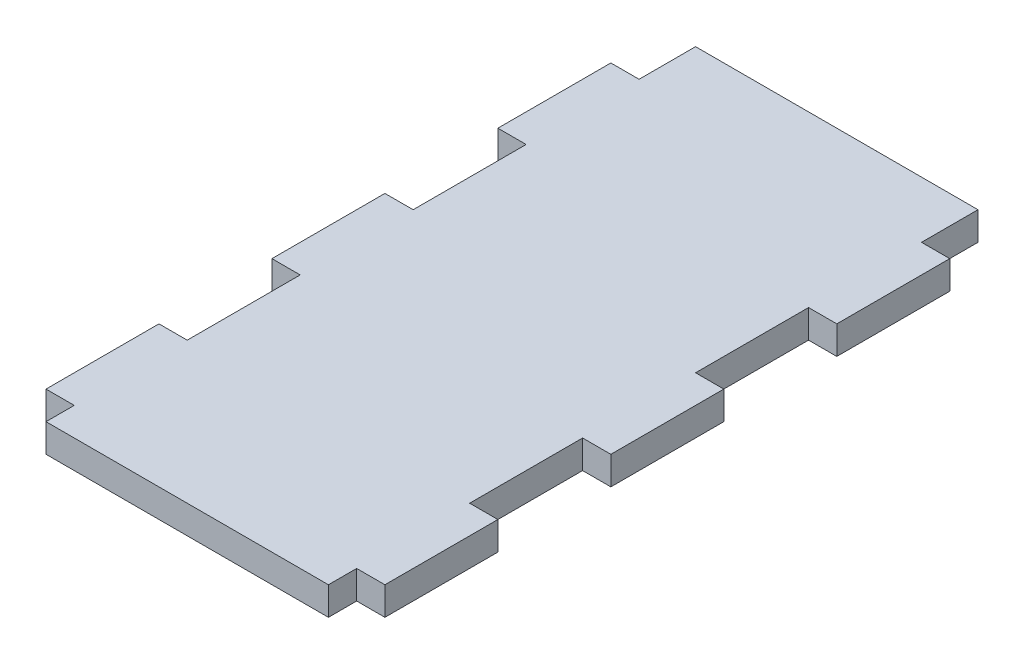
ISO-10303-21;
HEADER;
FILE_DESCRIPTION(('STEP AP214'),'2;1');
FILE_NAME('part.step','',(''),(''),'','','');
FILE_SCHEMA(('AUTOMOTIVE_DESIGN { 1 0 10303 214 1 1 1 1 }'));
ENDSEC;
DATA;
#1=APPLICATION_CONTEXT('core data for automotive mechanical design processes');
#2=APPLICATION_PROTOCOL_DEFINITION('international standard','automotive_design',2000,#1);
#3=PRODUCT_CONTEXT('',#1,'mechanical');
#4=PRODUCT('Part','Part','',(#3));
#5=PRODUCT_RELATED_PRODUCT_CATEGORY('part','',(#4));
#6=PRODUCT_DEFINITION_FORMATION('','',#4);
#7=PRODUCT_DEFINITION_CONTEXT('part definition',#1,'design');
#8=PRODUCT_DEFINITION('design','',#6,#7);
#9=PRODUCT_DEFINITION_SHAPE('','',#8);
#10=(LENGTH_UNIT() NAMED_UNIT(*) SI_UNIT(.MILLI.,.METRE.));
#11=(NAMED_UNIT(*) PLANE_ANGLE_UNIT() SI_UNIT($,.RADIAN.));
#12=(NAMED_UNIT(*) SI_UNIT($,.STERADIAN.) SOLID_ANGLE_UNIT());
#13=UNCERTAINTY_MEASURE_WITH_UNIT(LENGTH_MEASURE(1.E-05),#10,'distance_accuracy_value','');
#14=(GEOMETRIC_REPRESENTATION_CONTEXT(3) GLOBAL_UNCERTAINTY_ASSIGNED_CONTEXT((#13)) GLOBAL_UNIT_ASSIGNED_CONTEXT((#10,
#11,#12)) REPRESENTATION_CONTEXT('',''));
#15=CARTESIAN_POINT('',(0.,0.,0.));
#16=DIRECTION('',(0.,0.,1.));
#17=DIRECTION('',(1.,0.,0.));
#18=AXIS2_PLACEMENT_3D('',#15,#16,#17);
#19=CARTESIAN_POINT('',(38.1,6.35,-63.5));
#20=DIRECTION('',(0.,0.,1.));
#21=DIRECTION('',(1.,0.,0.));
#22=AXIS2_PLACEMENT_3D('',#19,#20,#21);
#23=PLANE('',#22);
#24=DIRECTION('',(0.,-1.,0.));
#25=VECTOR('',#24,1.);
#26=CARTESIAN_POINT('',(31.75,6.35,-63.5));
#27=LINE('',#26,#25);
#28=CARTESIAN_POINT('',(31.75,6.35,-63.5));
#29=VERTEX_POINT('',#28);
#30=CARTESIAN_POINT('',(31.75,0.,-63.5));
#31=VERTEX_POINT('',#30);
#32=EDGE_CURVE('E245',#29,#31,#27,.T.);
#33=ORIENTED_EDGE('',*,*,#32,.F.);
#34=DIRECTION('',(-1.,0.,0.));
#35=VECTOR('',#34,1.);
#36=CARTESIAN_POINT('',(38.1,6.35,-63.5));
#37=LINE('',#36,#35);
#38=CARTESIAN_POINT('',(38.1,6.35,-63.5));
#39=VERTEX_POINT('',#38);
#40=EDGE_CURVE('E389',#39,#29,#37,.T.);
#41=ORIENTED_EDGE('',*,*,#40,.F.);
#42=DIRECTION('',(0.,-1.,0.));
#43=VECTOR('',#42,1.);
#44=CARTESIAN_POINT('',(38.1,6.35,-63.5));
#45=LINE('',#44,#43);
#46=CARTESIAN_POINT('',(38.1,0.,-63.5));
#47=VERTEX_POINT('',#46);
#48=EDGE_CURVE('E410',#39,#47,#45,.T.);
#49=ORIENTED_EDGE('',*,*,#48,.T.);
#50=DIRECTION('',(-1.,0.,0.));
#51=VECTOR('',#50,1.);
#52=CARTESIAN_POINT('',(38.1,0.,-63.5));
#53=LINE('',#52,#51);
#54=EDGE_CURVE('E60',#47,#31,#53,.T.);
#55=ORIENTED_EDGE('',*,*,#54,.T.);
#56=EDGE_LOOP('',(#33,#41,#49,#55));
#57=FACE_BOUND('',#56,.T.);
#58=ADVANCED_FACE('F37',(#57),#23,.F.);
#59=DIRECTION('',(0.,1.,0.));
#60=VECTOR('',#59,1.);
#61=CARTESIAN_POINT('',(-31.75,6.35000000000001,-63.5));
#62=LINE('',#61,#60);
#63=CARTESIAN_POINT('',(-31.75,0.,-63.5));
#64=VERTEX_POINT('',#63);
#65=CARTESIAN_POINT('',(-31.75,6.35000000000001,-63.5));
#66=VERTEX_POINT('',#65);
#67=EDGE_CURVE('E52',#64,#66,#62,.T.);
#68=ORIENTED_EDGE('',*,*,#67,.F.);
#69=CARTESIAN_POINT('',(-38.1,0.,-63.5));
#70=VERTEX_POINT('',#69);
#71=EDGE_CURVE('E405',#64,#70,#53,.T.);
#72=ORIENTED_EDGE('',*,*,#71,.T.);
#73=DIRECTION('',(0.,-1.,0.));
#74=VECTOR('',#73,1.);
#75=CARTESIAN_POINT('',(-38.1,6.35,-63.5));
#76=LINE('',#75,#74);
#77=CARTESIAN_POINT('',(-38.1,6.35,-63.5));
#78=VERTEX_POINT('',#77);
#79=EDGE_CURVE('E392',#78,#70,#76,.T.);
#80=ORIENTED_EDGE('',*,*,#79,.F.);
#81=EDGE_CURVE('E387',#66,#78,#37,.T.);
#82=ORIENTED_EDGE('',*,*,#81,.F.);
#83=EDGE_LOOP('',(#68,#72,#80,#82));
#84=FACE_BOUND('',#83,.T.);
#85=ADVANCED_FACE('F489',(#84),#23,.F.);
#86=CARTESIAN_POINT('',(38.1,6.35,63.5));
#87=DIRECTION('',(0.,0.,-1.));
#88=DIRECTION('',(-1.,0.,0.));
#89=AXIS2_PLACEMENT_3D('',#86,#87,#88);
#90=PLANE('',#89);
#91=DIRECTION('',(0.,-1.,0.));
#92=VECTOR('',#91,1.);
#93=CARTESIAN_POINT('',(-31.75,6.35,63.5));
#94=LINE('',#93,#92);
#95=CARTESIAN_POINT('',(-31.75,6.35,63.5));
#96=VERTEX_POINT('',#95);
#97=CARTESIAN_POINT('',(-31.75,0.,63.5));
#98=VERTEX_POINT('',#97);
#99=EDGE_CURVE('E246',#96,#98,#94,.T.);
#100=ORIENTED_EDGE('',*,*,#99,.F.);
#101=DIRECTION('',(1.,0.,0.));
#102=VECTOR('',#101,1.);
#103=CARTESIAN_POINT('',(38.1,6.35,63.5));
#104=LINE('',#103,#102);
#105=CARTESIAN_POINT('',(-38.1,6.35,63.5));
#106=VERTEX_POINT('',#105);
#107=EDGE_CURVE('E380',#106,#96,#104,.T.);
#108=ORIENTED_EDGE('',*,*,#107,.F.);
#109=DIRECTION('',(0.,-1.,0.));
#110=VECTOR('',#109,1.);
#111=CARTESIAN_POINT('',(-38.1,6.35,63.5));
#112=LINE('',#111,#110);
#113=CARTESIAN_POINT('',(-38.1,0.,63.5));
#114=VERTEX_POINT('',#113);
#115=EDGE_CURVE('E11',#106,#114,#112,.T.);
#116=ORIENTED_EDGE('',*,*,#115,.T.);
#117=DIRECTION('',(1.,0.,0.));
#118=VECTOR('',#117,1.);
#119=CARTESIAN_POINT('',(38.1,0.,63.5));
#120=LINE('',#119,#118);
#121=EDGE_CURVE('E399',#114,#98,#120,.T.);
#122=ORIENTED_EDGE('',*,*,#121,.T.);
#123=EDGE_LOOP('',(#100,#108,#116,#122));
#124=FACE_BOUND('',#123,.T.);
#125=ADVANCED_FACE('F452',(#124),#90,.F.);
#126=DIRECTION('',(0.,1.,0.));
#127=VECTOR('',#126,1.);
#128=CARTESIAN_POINT('',(31.75,6.35000000000001,63.5));
#129=LINE('',#128,#127);
#130=CARTESIAN_POINT('',(31.75,0.,63.5));
#131=VERTEX_POINT('',#130);
#132=CARTESIAN_POINT('',(31.75,6.35000000000001,63.5));
#133=VERTEX_POINT('',#132);
#134=EDGE_CURVE('E249',#131,#133,#129,.T.);
#135=ORIENTED_EDGE('',*,*,#134,.F.);
#136=CARTESIAN_POINT('',(38.1,0.,63.5));
#137=VERTEX_POINT('',#136);
#138=EDGE_CURVE('E396',#131,#137,#120,.T.);
#139=ORIENTED_EDGE('',*,*,#138,.T.);
#140=DIRECTION('',(0.,-1.,0.));
#141=VECTOR('',#140,1.);
#142=CARTESIAN_POINT('',(38.1,6.35,63.5));
#143=LINE('',#142,#141);
#144=CARTESIAN_POINT('',(38.1,6.35,63.5));
#145=VERTEX_POINT('',#144);
#146=EDGE_CURVE('E45',#145,#137,#143,.T.);
#147=ORIENTED_EDGE('',*,*,#146,.F.);
#148=EDGE_CURVE('E377',#133,#145,#104,.T.);
#149=ORIENTED_EDGE('',*,*,#148,.F.);
#150=EDGE_LOOP('',(#135,#139,#147,#149));
#151=FACE_BOUND('',#150,.T.);
#152=ADVANCED_FACE('F438',(#151),#90,.F.);
#153=CARTESIAN_POINT('',(-38.1,6.35,63.5));
#154=DIRECTION('',(1.,0.,0.));
#155=DIRECTION('',(0.,0.,-1.));
#156=AXIS2_PLACEMENT_3D('',#153,#154,#155);
#157=PLANE('',#156);
#158=DIRECTION('',(0.,0.,1.));
#159=VECTOR('',#158,1.);
#160=CARTESIAN_POINT('',(-38.1,0.,63.5));
#161=LINE('',#160,#159);
#162=CARTESIAN_POINT('',(-38.1000000000007,0.,-38.0999999999998));
#163=VERTEX_POINT('',#162);
#164=EDGE_CURVE('E393',#70,#163,#161,.T.);
#165=ORIENTED_EDGE('',*,*,#164,.T.);
#166=DIRECTION('',(0.,1.,0.));
#167=VECTOR('',#166,1.);
#168=CARTESIAN_POINT('',(-38.1000000000007,0.,-38.0999999999998));
#169=LINE('',#168,#167);
#170=CARTESIAN_POINT('',(-38.1000000000007,6.35000000000004,-38.0999999999998));
#171=VERTEX_POINT('',#170);
#172=EDGE_CURVE('E295',#163,#171,#169,.T.);
#173=ORIENTED_EDGE('',*,*,#172,.T.);
#174=DIRECTION('',(0.,0.,1.));
#175=VECTOR('',#174,1.);
#176=CARTESIAN_POINT('',(-38.1,6.35,63.5));
#177=LINE('',#176,#175);
#178=EDGE_CURVE('E374',#78,#171,#177,.T.);
#179=ORIENTED_EDGE('',*,*,#178,.F.);
#180=ORIENTED_EDGE('',*,*,#79,.T.);
#181=EDGE_LOOP('',(#165,#173,#179,#180));
#182=FACE_BOUND('',#181,.T.);
#183=ADVANCED_FACE('F486',(#182),#157,.F.);
#184=CARTESIAN_POINT('',(-38.1000000000006,6.35000000000002,-12.6999999999998));
#185=VERTEX_POINT('',#184);
#186=CARTESIAN_POINT('',(-38.1000000000005,6.35000000000002,12.7000000000002));
#187=VERTEX_POINT('',#186);
#188=EDGE_CURVE('E378',#185,#187,#177,.T.);
#189=ORIENTED_EDGE('',*,*,#188,.F.);
#190=DIRECTION('',(0.,-1.,0.));
#191=VECTOR('',#190,1.);
#192=CARTESIAN_POINT('',(-38.1000000000006,0.,-12.6999999999998));
#193=LINE('',#192,#191);
#194=CARTESIAN_POINT('',(-38.1000000000006,0.,-12.6999999999998));
#195=VERTEX_POINT('',#194);
#196=EDGE_CURVE('E283',#185,#195,#193,.T.);
#197=ORIENTED_EDGE('',*,*,#196,.T.);
#198=CARTESIAN_POINT('',(-38.1000000000005,0.,12.7000000000002));
#199=VERTEX_POINT('',#198);
#200=EDGE_CURVE('E397',#195,#199,#161,.T.);
#201=ORIENTED_EDGE('',*,*,#200,.T.);
#202=DIRECTION('',(0.,1.,0.));
#203=VECTOR('',#202,1.);
#204=CARTESIAN_POINT('',(-38.1000000000005,0.,12.7000000000002));
#205=LINE('',#204,#203);
#206=EDGE_CURVE('E286',#199,#187,#205,.T.);
#207=ORIENTED_EDGE('',*,*,#206,.T.);
#208=EDGE_LOOP('',(#189,#197,#201,#207));
#209=FACE_BOUND('',#208,.T.);
#210=ADVANCED_FACE('F462',(#209),#157,.F.);
#211=CARTESIAN_POINT('',(38.1,6.35,63.5));
#212=DIRECTION('',(-1.,0.,0.));
#213=DIRECTION('',(0.,0.,1.));
#214=AXIS2_PLACEMENT_3D('',#211,#212,#213);
#215=PLANE('',#214);
#216=DIRECTION('',(0.,-1.,0.));
#217=VECTOR('',#216,1.);
#218=CARTESIAN_POINT('',(38.099999999872,1.78676518025611E-13,38.1));
#219=LINE('',#218,#217);
#220=CARTESIAN_POINT('',(38.099999999872,6.35000000000019,38.1));
#221=VERTEX_POINT('',#220);
#222=CARTESIAN_POINT('',(38.099999999872,1.78676518025611E-13,38.1));
#223=VERTEX_POINT('',#222);
#224=EDGE_CURVE('E357',#221,#223,#219,.T.);
#225=ORIENTED_EDGE('',*,*,#224,.F.);
#226=DIRECTION('',(0.,0.,-1.));
#227=VECTOR('',#226,1.);
#228=CARTESIAN_POINT('',(38.1,6.35,63.5));
#229=LINE('',#228,#227);
#230=EDGE_CURVE('E384',#145,#221,#229,.T.);
#231=ORIENTED_EDGE('',*,*,#230,.F.);
#232=ORIENTED_EDGE('',*,*,#146,.T.);
#233=DIRECTION('',(0.,0.,-1.));
#234=VECTOR('',#233,1.);
#235=CARTESIAN_POINT('',(38.1,0.,63.5));
#236=LINE('',#235,#234);
#237=EDGE_CURVE('E402',#137,#223,#236,.T.);
#238=ORIENTED_EDGE('',*,*,#237,.T.);
#239=EDGE_LOOP('',(#225,#231,#232,#238));
#240=FACE_BOUND('',#239,.T.);
#241=ADVANCED_FACE('F417',(#240),#215,.F.);
#242=DIRECTION('',(0.,1.,0.));
#243=VECTOR('',#242,1.);
#244=CARTESIAN_POINT('',(38.099999999872,1.92554305833426E-13,12.7));
#245=LINE('',#244,#243);
#246=CARTESIAN_POINT('',(38.099999999872,1.92554305833426E-13,12.7));
#247=VERTEX_POINT('',#246);
#248=CARTESIAN_POINT('',(38.099999999872,6.35000000000019,12.7));
#249=VERTEX_POINT('',#248);
#250=EDGE_CURVE('E325',#247,#249,#245,.T.);
#251=ORIENTED_EDGE('',*,*,#250,.F.);
#252=CARTESIAN_POINT('',(38.099999999872,2.20309881449055E-13,-12.7));
#253=VERTEX_POINT('',#252);
#254=EDGE_CURVE('E406',#247,#253,#236,.T.);
#255=ORIENTED_EDGE('',*,*,#254,.T.);
#256=DIRECTION('',(0.,-1.,0.));
#257=VECTOR('',#256,1.);
#258=CARTESIAN_POINT('',(38.099999999872,2.20309881449055E-13,-12.7));
#259=LINE('',#258,#257);
#260=CARTESIAN_POINT('',(38.099999999872,6.35000000000018,-12.7));
#261=VERTEX_POINT('',#260);
#262=EDGE_CURVE('E327',#261,#253,#259,.T.);
#263=ORIENTED_EDGE('',*,*,#262,.F.);
#264=EDGE_CURVE('E388',#249,#261,#229,.T.);
#265=ORIENTED_EDGE('',*,*,#264,.F.);
#266=EDGE_LOOP('',(#251,#255,#263,#265));
#267=FACE_BOUND('',#266,.T.);
#268=ADVANCED_FACE('F513',(#267),#215,.F.);
#269=DIRECTION('',(0.,1.,0.));
#270=VECTOR('',#269,1.);
#271=CARTESIAN_POINT('',(38.099999999872,2.27248775352962E-13,-38.1));
#272=LINE('',#271,#270);
#273=CARTESIAN_POINT('',(38.099999999872,2.27248775352962E-13,-38.1));
#274=VERTEX_POINT('',#273);
#275=CARTESIAN_POINT('',(38.099999999872,6.35000000000021,-38.1));
#276=VERTEX_POINT('',#275);
#277=EDGE_CURVE('E347',#274,#276,#272,.T.);
#278=ORIENTED_EDGE('',*,*,#277,.F.);
#279=EDGE_CURVE('E401',#274,#47,#236,.T.);
#280=ORIENTED_EDGE('',*,*,#279,.T.);
#281=ORIENTED_EDGE('',*,*,#48,.F.);
#282=EDGE_CURVE('E383',#276,#39,#229,.T.);
#283=ORIENTED_EDGE('',*,*,#282,.F.);
#284=EDGE_LOOP('',(#278,#280,#281,#283));
#285=FACE_BOUND('',#284,.T.);
#286=ADVANCED_FACE('F522',(#285),#215,.F.);
#287=CARTESIAN_POINT('',(0.,0.,0.));
#288=DIRECTION('',(0.,1.,0.));
#289=DIRECTION('',(0.,0.,1.));
#290=AXIS2_PLACEMENT_3D('',#287,#288,#289);
#291=PLANE('',#290);
#292=DIRECTION('',(0.,0.,-1.));
#293=VECTOR('',#292,1.);
#294=CARTESIAN_POINT('',(-31.7500000000001,0.,82.935192090802));
#295=LINE('',#294,#293);
#296=CARTESIAN_POINT('',(-31.7500000000006,0.,-12.6999999999998));
#297=VERTEX_POINT('',#296);
#298=CARTESIAN_POINT('',(-31.7500000000007,0.,-38.0999999999998));
#299=VERTEX_POINT('',#298);
#300=EDGE_CURVE('E311',#297,#299,#295,.T.);
#301=ORIENTED_EDGE('',*,*,#300,.T.);
#302=DIRECTION('',(-1.,0.,0.));
#303=VECTOR('',#302,1.);
#304=CARTESIAN_POINT('',(-31.7500000000007,0.,-38.0999999999998));
#305=LINE('',#304,#303);
#306=EDGE_CURVE('E308',#299,#163,#305,.T.);
#307=ORIENTED_EDGE('',*,*,#306,.T.);
#308=ORIENTED_EDGE('',*,*,#164,.F.);
#309=ORIENTED_EDGE('',*,*,#71,.F.);
#310=DIRECTION('',(0.,0.,1.));
#311=VECTOR('',#310,1.);
#312=CARTESIAN_POINT('',(-31.75,0.,-76.2));
#313=LINE('',#312,#311);
#314=CARTESIAN_POINT('',(-31.75,0.,-76.2));
#315=VERTEX_POINT('',#314);
#316=EDGE_CURVE('E230',#315,#64,#313,.T.);
#317=ORIENTED_EDGE('',*,*,#316,.F.);
#318=DIRECTION('',(-1.,0.,0.));
#319=VECTOR('',#318,1.);
#320=CARTESIAN_POINT('',(31.75,0.,-76.2));
#321=LINE('',#320,#319);
#322=CARTESIAN_POINT('',(31.75,0.,-76.2));
#323=VERTEX_POINT('',#322);
#324=EDGE_CURVE('E222',#323,#315,#321,.T.);
#325=ORIENTED_EDGE('',*,*,#324,.F.);
#326=DIRECTION('',(0.,0.,1.));
#327=VECTOR('',#326,1.);
#328=CARTESIAN_POINT('',(31.75,0.,-76.2));
#329=LINE('',#328,#327);
#330=EDGE_CURVE('E227',#323,#31,#329,.T.);
#331=ORIENTED_EDGE('',*,*,#330,.T.);
#332=ORIENTED_EDGE('',*,*,#54,.F.);
#333=ORIENTED_EDGE('',*,*,#279,.F.);
#334=DIRECTION('',(-1.,0.,0.));
#335=VECTOR('',#334,1.);
#336=CARTESIAN_POINT('',(38.099999999872,2.27248775352962E-13,-38.1));
#337=LINE('',#336,#335);
#338=CARTESIAN_POINT('',(31.749999999872,1.96023752785379E-13,-38.1));
#339=VERTEX_POINT('',#338);
#340=EDGE_CURVE('E352',#274,#339,#337,.T.);
#341=ORIENTED_EDGE('',*,*,#340,.T.);
#342=DIRECTION('',(0.,0.,-1.));
#343=VECTOR('',#342,1.);
#344=CARTESIAN_POINT('',(31.749999999872,1.35308431126191E-13,82.9351920908019));
#345=LINE('',#344,#343);
#346=CARTESIAN_POINT('',(31.749999999872,0.,-12.7));
#347=VERTEX_POINT('',#346);
#348=EDGE_CURVE('E355',#347,#339,#345,.T.);
#349=ORIENTED_EDGE('',*,*,#348,.F.);
#350=DIRECTION('',(-1.,0.,0.));
#351=VECTOR('',#350,1.);
#352=CARTESIAN_POINT('',(38.099999999872,2.20309881449055E-13,-12.7));
#353=LINE('',#352,#351);
#354=EDGE_CURVE('E341',#253,#347,#353,.T.);
#355=ORIENTED_EDGE('',*,*,#354,.F.);
#356=ORIENTED_EDGE('',*,*,#254,.F.);
#357=DIRECTION('',(-1.,0.,0.));
#358=VECTOR('',#357,1.);
#359=CARTESIAN_POINT('',(38.099999999872,1.92554305833426E-13,12.7));
#360=LINE('',#359,#358);
#361=CARTESIAN_POINT('',(31.749999999872,1.61329283265843E-13,12.7));
#362=VERTEX_POINT('',#361);
#363=EDGE_CURVE('E337',#247,#362,#360,.T.);
#364=ORIENTED_EDGE('',*,*,#363,.T.);
#365=CARTESIAN_POINT('',(31.749999999872,0.,38.1));
#366=VERTEX_POINT('',#365);
#367=EDGE_CURVE('E319',#366,#362,#345,.T.);
#368=ORIENTED_EDGE('',*,*,#367,.F.);
#369=DIRECTION('',(-1.,0.,0.));
#370=VECTOR('',#369,1.);
#371=CARTESIAN_POINT('',(38.099999999872,1.78676518025611E-13,38.1));
#372=LINE('',#371,#370);
#373=EDGE_CURVE('E334',#223,#366,#372,.T.);
#374=ORIENTED_EDGE('',*,*,#373,.F.);
#375=ORIENTED_EDGE('',*,*,#237,.F.);
#376=ORIENTED_EDGE('',*,*,#138,.F.);
#377=DIRECTION('',(0.,0.,-1.));
#378=VECTOR('',#377,1.);
#379=CARTESIAN_POINT('',(31.75,0.,69.85));
#380=LINE('',#379,#378);
#381=CARTESIAN_POINT('',(31.75,0.,69.85));
#382=VERTEX_POINT('',#381);
#383=EDGE_CURVE('E272',#382,#131,#380,.T.);
#384=ORIENTED_EDGE('',*,*,#383,.F.);
#385=DIRECTION('',(1.,0.,0.));
#386=VECTOR('',#385,1.);
#387=CARTESIAN_POINT('',(-31.75,0.,69.85));
#388=LINE('',#387,#386);
#389=CARTESIAN_POINT('',(-31.75,0.,69.85));
#390=VERTEX_POINT('',#389);
#391=EDGE_CURVE('E258',#390,#382,#388,.T.);
#392=ORIENTED_EDGE('',*,*,#391,.F.);
#393=DIRECTION('',(0.,0.,-1.));
#394=VECTOR('',#393,1.);
#395=CARTESIAN_POINT('',(-31.75,0.,69.85));
#396=LINE('',#395,#394);
#397=EDGE_CURVE('E275',#390,#98,#396,.T.);
#398=ORIENTED_EDGE('',*,*,#397,.T.);
#399=ORIENTED_EDGE('',*,*,#121,.F.);
#400=CARTESIAN_POINT('',(-38.1000000000003,0.,38.1000000000002));
#401=VERTEX_POINT('',#400);
#402=EDGE_CURVE('E398',#401,#114,#161,.T.);
#403=ORIENTED_EDGE('',*,*,#402,.F.);
#404=DIRECTION('',(-1.,0.,0.));
#405=VECTOR('',#404,1.);
#406=CARTESIAN_POINT('',(-31.7500000000003,0.,38.1000000000002));
#407=LINE('',#406,#405);
#408=CARTESIAN_POINT('',(-31.7500000000003,0.,38.1000000000002));
#409=VERTEX_POINT('',#408);
#410=EDGE_CURVE('E289',#409,#401,#407,.T.);
#411=ORIENTED_EDGE('',*,*,#410,.F.);
#412=CARTESIAN_POINT('',(-31.7500000000005,0.,12.7000000000002));
#413=VERTEX_POINT('',#412);
#414=EDGE_CURVE('E324',#409,#413,#295,.T.);
#415=ORIENTED_EDGE('',*,*,#414,.T.);
#416=DIRECTION('',(-1.,0.,0.));
#417=VECTOR('',#416,1.);
#418=CARTESIAN_POINT('',(-31.7500000000005,0.,12.7000000000002));
#419=LINE('',#418,#417);
#420=EDGE_CURVE('E292',#413,#199,#419,.T.);
#421=ORIENTED_EDGE('',*,*,#420,.T.);
#422=ORIENTED_EDGE('',*,*,#200,.F.);
#423=DIRECTION('',(-1.,0.,0.));
#424=VECTOR('',#423,1.);
#425=CARTESIAN_POINT('',(-31.7500000000006,0.,-12.6999999999998));
#426=LINE('',#425,#424);
#427=EDGE_CURVE('E296',#297,#195,#426,.T.);
#428=ORIENTED_EDGE('',*,*,#427,.F.);
#429=EDGE_LOOP('',(#301,#307,#308,#309,#317,#325,#331,#332,#333,#341,#349,#355,#356,#364,#368,
#374,#375,#376,#384,#392,#398,#399,#403,#411,#415,#421,#422,#428));
#430=FACE_BOUND('',#429,.T.);
#431=ADVANCED_FACE('F225',(#430),#291,.F.);
#432=CARTESIAN_POINT('',(-38.1000000000003,6.35000000000002,38.1000000000002));
#433=VERTEX_POINT('',#432);
#434=EDGE_CURVE('E379',#433,#106,#177,.T.);
#435=ORIENTED_EDGE('',*,*,#434,.F.);
#436=DIRECTION('',(0.,-1.,0.));
#437=VECTOR('',#436,1.);
#438=CARTESIAN_POINT('',(-38.1000000000003,0.,38.1000000000002));
#439=LINE('',#438,#437);
#440=EDGE_CURVE('E316',#433,#401,#439,.T.);
#441=ORIENTED_EDGE('',*,*,#440,.T.);
#442=ORIENTED_EDGE('',*,*,#402,.T.);
#443=ORIENTED_EDGE('',*,*,#115,.F.);
#444=EDGE_LOOP('',(#435,#441,#442,#443));
#445=FACE_BOUND('',#444,.T.);
#446=ADVANCED_FACE('F39',(#445),#157,.F.);
#447=CARTESIAN_POINT('',(0.,6.35,0.));
#448=DIRECTION('',(0.,1.,0.));
#449=DIRECTION('',(0.,0.,1.));
#450=AXIS2_PLACEMENT_3D('',#447,#448,#449);
#451=PLANE('',#450);
#452=DIRECTION('',(-1.,0.,0.));
#453=VECTOR('',#452,1.);
#454=CARTESIAN_POINT('',(-31.7500000000007,6.35000000000004,-38.0999999999998));
#455=LINE('',#454,#453);
#456=CARTESIAN_POINT('',(-31.7500000000007,6.35000000000004,-38.0999999999998));
#457=VERTEX_POINT('',#456);
#458=EDGE_CURVE('E305',#457,#171,#455,.T.);
#459=ORIENTED_EDGE('',*,*,#458,.F.);
#460=DIRECTION('',(0.,0.,1.));
#461=VECTOR('',#460,1.);
#462=CARTESIAN_POINT('',(-31.7500000000005,6.35,1.6021080816054E-13));
#463=LINE('',#462,#461);
#464=CARTESIAN_POINT('',(-31.7500000000006,6.35000000000001,-12.6999999999998));
#465=VERTEX_POINT('',#464);
#466=EDGE_CURVE('E373',#457,#465,#463,.T.);
#467=ORIENTED_EDGE('',*,*,#466,.T.);
#468=DIRECTION('',(-1.,0.,0.));
#469=VECTOR('',#468,1.);
#470=CARTESIAN_POINT('',(-31.7500000000006,6.35000000000002,-12.6999999999998));
#471=LINE('',#470,#469);
#472=EDGE_CURVE('E298',#465,#185,#471,.T.);
#473=ORIENTED_EDGE('',*,*,#472,.T.);
#474=ORIENTED_EDGE('',*,*,#188,.T.);
#475=DIRECTION('',(-1.,0.,0.));
#476=VECTOR('',#475,1.);
#477=CARTESIAN_POINT('',(-31.7500000000005,6.35000000000001,12.7000000000002));
#478=LINE('',#477,#476);
#479=CARTESIAN_POINT('',(-31.7500000000005,6.35000000000001,12.7000000000002));
#480=VERTEX_POINT('',#479);
#481=EDGE_CURVE('E285',#480,#187,#478,.T.);
#482=ORIENTED_EDGE('',*,*,#481,.F.);
#483=CARTESIAN_POINT('',(-31.7500000000003,6.35000000000001,38.1000000000002));
#484=VERTEX_POINT('',#483);
#485=EDGE_CURVE('E370',#480,#484,#463,.T.);
#486=ORIENTED_EDGE('',*,*,#485,.T.);
#487=DIRECTION('',(-1.,0.,0.));
#488=VECTOR('',#487,1.);
#489=CARTESIAN_POINT('',(-31.7500000000003,6.35000000000001,38.1000000000002));
#490=LINE('',#489,#488);
#491=EDGE_CURVE('E315',#484,#433,#490,.T.);
#492=ORIENTED_EDGE('',*,*,#491,.T.);
#493=ORIENTED_EDGE('',*,*,#434,.T.);
#494=ORIENTED_EDGE('',*,*,#107,.T.);
#495=DIRECTION('',(0.,0.,-1.));
#496=VECTOR('',#495,1.);
#497=CARTESIAN_POINT('',(-31.75,6.35,69.85));
#498=LINE('',#497,#496);
#499=CARTESIAN_POINT('',(-31.75,6.35,69.85));
#500=VERTEX_POINT('',#499);
#501=EDGE_CURVE('E263',#500,#96,#498,.T.);
#502=ORIENTED_EDGE('',*,*,#501,.F.);
#503=DIRECTION('',(-1.,0.,0.));
#504=VECTOR('',#503,1.);
#505=CARTESIAN_POINT('',(-31.75,6.35,69.85));
#506=LINE('',#505,#504);
#507=CARTESIAN_POINT('',(31.75,6.35000000000001,69.85));
#508=VERTEX_POINT('',#507);
#509=EDGE_CURVE('E262',#508,#500,#506,.T.);
#510=ORIENTED_EDGE('',*,*,#509,.F.);
#511=DIRECTION('',(0.,0.,-1.));
#512=VECTOR('',#511,1.);
#513=CARTESIAN_POINT('',(31.75,6.35000000000001,69.85));
#514=LINE('',#513,#512);
#515=EDGE_CURVE('E269',#508,#133,#514,.T.);
#516=ORIENTED_EDGE('',*,*,#515,.T.);
#517=ORIENTED_EDGE('',*,*,#148,.T.);
#518=ORIENTED_EDGE('',*,*,#230,.T.);
#519=DIRECTION('',(-1.,0.,0.));
#520=VECTOR('',#519,1.);
#521=CARTESIAN_POINT('',(38.099999999872,6.35000000000019,38.1));
#522=LINE('',#521,#520);
#523=CARTESIAN_POINT('',(31.749999999872,6.35000000000016,38.1));
#524=VERTEX_POINT('',#523);
#525=EDGE_CURVE('E359',#221,#524,#522,.T.);
#526=ORIENTED_EDGE('',*,*,#525,.T.);
#527=DIRECTION('',(0.,0.,1.));
#528=VECTOR('',#527,1.);
#529=CARTESIAN_POINT('',(31.7499999998719,6.35,0.));
#530=LINE('',#529,#528);
#531=CARTESIAN_POINT('',(31.749999999872,6.35000000000016,12.7));
#532=VERTEX_POINT('',#531);
#533=EDGE_CURVE('E367',#532,#524,#530,.T.);
#534=ORIENTED_EDGE('',*,*,#533,.F.);
#535=DIRECTION('',(-1.,0.,0.));
#536=VECTOR('',#535,1.);
#537=CARTESIAN_POINT('',(38.099999999872,6.35000000000019,12.7));
#538=LINE('',#537,#536);
#539=EDGE_CURVE('E330',#249,#532,#538,.T.);
#540=ORIENTED_EDGE('',*,*,#539,.F.);
#541=ORIENTED_EDGE('',*,*,#264,.T.);
#542=DIRECTION('',(-1.,0.,0.));
#543=VECTOR('',#542,1.);
#544=CARTESIAN_POINT('',(38.099999999872,6.35000000000019,-12.7));
#545=LINE('',#544,#543);
#546=CARTESIAN_POINT('',(31.749999999872,6.35000000000016,-12.7));
#547=VERTEX_POINT('',#546);
#548=EDGE_CURVE('E343',#261,#547,#545,.T.);
#549=ORIENTED_EDGE('',*,*,#548,.T.);
#550=CARTESIAN_POINT('',(31.749999999872,6.35000000000018,-38.1));
#551=VERTEX_POINT('',#550);
#552=EDGE_CURVE('E369',#551,#547,#530,.T.);
#553=ORIENTED_EDGE('',*,*,#552,.F.);
#554=DIRECTION('',(-1.,0.,0.));
#555=VECTOR('',#554,1.);
#556=CARTESIAN_POINT('',(38.099999999872,6.35000000000021,-38.1));
#557=LINE('',#556,#555);
#558=EDGE_CURVE('E349',#276,#551,#557,.T.);
#559=ORIENTED_EDGE('',*,*,#558,.F.);
#560=ORIENTED_EDGE('',*,*,#282,.T.);
#561=ORIENTED_EDGE('',*,*,#40,.T.);
#562=DIRECTION('',(0.,0.,1.));
#563=VECTOR('',#562,1.);
#564=CARTESIAN_POINT('',(31.75,6.35,-76.2));
#565=LINE('',#564,#563);
#566=CARTESIAN_POINT('',(31.75,6.35,-76.2));
#567=VERTEX_POINT('',#566);
#568=EDGE_CURVE('E495',#567,#29,#565,.T.);
#569=ORIENTED_EDGE('',*,*,#568,.F.);
#570=DIRECTION('',(1.,0.,0.));
#571=VECTOR('',#570,1.);
#572=CARTESIAN_POINT('',(31.75,6.35,-76.2));
#573=LINE('',#572,#571);
#574=CARTESIAN_POINT('',(-31.75,6.35000000000001,-76.2));
#575=VERTEX_POINT('',#574);
#576=EDGE_CURVE('E239',#575,#567,#573,.T.);
#577=ORIENTED_EDGE('',*,*,#576,.F.);
#578=DIRECTION('',(0.,0.,1.));
#579=VECTOR('',#578,1.);
#580=CARTESIAN_POINT('',(-31.75,6.35000000000001,-76.2));
#581=LINE('',#580,#579);
#582=EDGE_CURVE('E251',#575,#66,#581,.T.);
#583=ORIENTED_EDGE('',*,*,#582,.T.);
#584=ORIENTED_EDGE('',*,*,#81,.T.);
#585=ORIENTED_EDGE('',*,*,#178,.T.);
#586=EDGE_LOOP('',(#459,#467,#473,#474,#482,#486,#492,#493,#494,#502,#510,#516,#517,#518,#526,
#534,#540,#541,#549,#553,#559,#560,#561,#569,#577,#583,#584,#585));
#587=FACE_BOUND('',#586,.T.);
#588=ADVANCED_FACE('F433',(#587),#451,.T.);
#589=CARTESIAN_POINT('',(31.749999999872,6.735192090802,82.9351920908019));
#590=DIRECTION('',(-1.,0.,0.));
#591=DIRECTION('',(0.,0.707106781186548,-0.707106781186548));
#592=AXIS2_PLACEMENT_3D('',#589,#590,#591);
#593=PLANE('',#592);
#594=ORIENTED_EDGE('',*,*,#533,.T.);
#595=DIRECTION('',(0.,-1.,0.));
#596=VECTOR('',#595,1.);
#597=CARTESIAN_POINT('',(31.749999999872,1.47451495458029E-13,38.1));
#598=LINE('',#597,#596);
#599=EDGE_CURVE('E278',#524,#366,#598,.T.);
#600=ORIENTED_EDGE('',*,*,#599,.T.);
#601=ORIENTED_EDGE('',*,*,#367,.T.);
#602=DIRECTION('',(0.,1.,0.));
#603=VECTOR('',#602,1.);
#604=CARTESIAN_POINT('',(31.749999999872,1.61329283265843E-13,12.7));
#605=LINE('',#604,#603);
#606=EDGE_CURVE('E331',#362,#532,#605,.T.);
#607=ORIENTED_EDGE('',*,*,#606,.T.);
#608=EDGE_LOOP('',(#594,#600,#601,#607));
#609=FACE_BOUND('',#608,.T.);
#610=ADVANCED_FACE('F428',(#609),#593,.F.);
#611=CARTESIAN_POINT('',(38.099999999872,1.92554305833426E-13,12.7));
#612=DIRECTION('',(0.,0.,1.));
#613=DIRECTION('',(0.,1.,0.));
#614=AXIS2_PLACEMENT_3D('',#611,#612,#613);
#615=PLANE('',#614);
#616=ORIENTED_EDGE('',*,*,#606,.F.);
#617=ORIENTED_EDGE('',*,*,#363,.F.);
#618=ORIENTED_EDGE('',*,*,#250,.T.);
#619=ORIENTED_EDGE('',*,*,#539,.T.);
#620=EDGE_LOOP('',(#616,#617,#618,#619));
#621=FACE_BOUND('',#620,.T.);
#622=ADVANCED_FACE('F587',(#621),#615,.T.);
#623=CARTESIAN_POINT('',(38.099999999872,1.78676518025611E-13,38.1));
#624=DIRECTION('',(0.,0.,-1.));
#625=DIRECTION('',(0.,-1.,0.));
#626=AXIS2_PLACEMENT_3D('',#623,#624,#625);
#627=PLANE('',#626);
#628=ORIENTED_EDGE('',*,*,#599,.F.);
#629=ORIENTED_EDGE('',*,*,#525,.F.);
#630=ORIENTED_EDGE('',*,*,#224,.T.);
#631=ORIENTED_EDGE('',*,*,#373,.T.);
#632=EDGE_LOOP('',(#628,#629,#630,#631));
#633=FACE_BOUND('',#632,.T.);
#634=ADVANCED_FACE('F426',(#633),#627,.T.);
#635=ORIENTED_EDGE('',*,*,#552,.T.);
#636=DIRECTION('',(0.,-1.,0.));
#637=VECTOR('',#636,1.);
#638=CARTESIAN_POINT('',(31.749999999872,1.89084858881472E-13,-12.7));
#639=LINE('',#638,#637);
#640=EDGE_CURVE('E328',#547,#347,#639,.T.);
#641=ORIENTED_EDGE('',*,*,#640,.T.);
#642=ORIENTED_EDGE('',*,*,#348,.T.);
#643=DIRECTION('',(0.,1.,0.));
#644=VECTOR('',#643,1.);
#645=CARTESIAN_POINT('',(31.749999999872,1.96023752785379E-13,-38.1));
#646=LINE('',#645,#644);
#647=EDGE_CURVE('E340',#339,#551,#646,.T.);
#648=ORIENTED_EDGE('',*,*,#647,.T.);
#649=EDGE_LOOP('',(#635,#641,#642,#648));
#650=FACE_BOUND('',#649,.T.);
#651=ADVANCED_FACE('F519',(#650),#593,.F.);
#652=CARTESIAN_POINT('',(38.099999999872,2.20309881449055E-13,-12.7));
#653=DIRECTION('',(0.,0.,-1.));
#654=DIRECTION('',(0.,-1.,0.));
#655=AXIS2_PLACEMENT_3D('',#652,#653,#654);
#656=PLANE('',#655);
#657=ORIENTED_EDGE('',*,*,#640,.F.);
#658=ORIENTED_EDGE('',*,*,#548,.F.);
#659=ORIENTED_EDGE('',*,*,#262,.T.);
#660=ORIENTED_EDGE('',*,*,#354,.T.);
#661=EDGE_LOOP('',(#657,#658,#659,#660));
#662=FACE_BOUND('',#661,.T.);
#663=ADVANCED_FACE('F517',(#662),#656,.T.);
#664=CARTESIAN_POINT('',(38.099999999872,2.27248775352962E-13,-38.1));
#665=DIRECTION('',(0.,0.,1.));
#666=DIRECTION('',(0.,1.,0.));
#667=AXIS2_PLACEMENT_3D('',#664,#665,#666);
#668=PLANE('',#667);
#669=ORIENTED_EDGE('',*,*,#647,.F.);
#670=ORIENTED_EDGE('',*,*,#340,.F.);
#671=ORIENTED_EDGE('',*,*,#277,.T.);
#672=ORIENTED_EDGE('',*,*,#558,.T.);
#673=EDGE_LOOP('',(#669,#670,#671,#672));
#674=FACE_BOUND('',#673,.T.);
#675=ADVANCED_FACE('F523',(#674),#668,.T.);
#676=CARTESIAN_POINT('',(-31.7500000000001,6.73519209080186,82.935192090802));
#677=DIRECTION('',(-1.,0.,0.));
#678=DIRECTION('',(0.,0.707106781186548,-0.707106781186548));
#679=AXIS2_PLACEMENT_3D('',#676,#677,#678);
#680=PLANE('',#679);
#681=DIRECTION('',(0.,1.,0.));
#682=VECTOR('',#681,1.);
#683=CARTESIAN_POINT('',(-31.7500000000005,0.,12.7000000000002));
#684=LINE('',#683,#682);
#685=EDGE_CURVE('E279',#413,#480,#684,.T.);
#686=ORIENTED_EDGE('',*,*,#685,.F.);
#687=ORIENTED_EDGE('',*,*,#414,.F.);
#688=DIRECTION('',(0.,-1.,0.));
#689=VECTOR('',#688,1.);
#690=CARTESIAN_POINT('',(-31.7500000000003,0.,38.1000000000002));
#691=LINE('',#690,#689);
#692=EDGE_CURVE('E313',#484,#409,#691,.T.);
#693=ORIENTED_EDGE('',*,*,#692,.F.);
#694=ORIENTED_EDGE('',*,*,#485,.F.);
#695=EDGE_LOOP('',(#686,#687,#693,#694));
#696=FACE_BOUND('',#695,.T.);
#697=ADVANCED_FACE('F475',(#696),#680,.T.);
#698=CARTESIAN_POINT('',(-31.7500000000005,0.,12.7000000000002));
#699=DIRECTION('',(0.,0.,1.));
#700=DIRECTION('',(0.,1.,0.));
#701=AXIS2_PLACEMENT_3D('',#698,#699,#700);
#702=PLANE('',#701);
#703=ORIENTED_EDGE('',*,*,#206,.F.);
#704=ORIENTED_EDGE('',*,*,#420,.F.);
#705=ORIENTED_EDGE('',*,*,#685,.T.);
#706=ORIENTED_EDGE('',*,*,#481,.T.);
#707=EDGE_LOOP('',(#703,#704,#705,#706));
#708=FACE_BOUND('',#707,.T.);
#709=ADVANCED_FACE('F466',(#708),#702,.T.);
#710=CARTESIAN_POINT('',(-31.7500000000003,0.,38.1000000000002));
#711=DIRECTION('',(0.,0.,-1.));
#712=DIRECTION('',(0.,-1.,0.));
#713=AXIS2_PLACEMENT_3D('',#710,#711,#712);
#714=PLANE('',#713);
#715=ORIENTED_EDGE('',*,*,#440,.F.);
#716=ORIENTED_EDGE('',*,*,#491,.F.);
#717=ORIENTED_EDGE('',*,*,#692,.T.);
#718=ORIENTED_EDGE('',*,*,#410,.T.);
#719=EDGE_LOOP('',(#715,#716,#717,#718));
#720=FACE_BOUND('',#719,.T.);
#721=ADVANCED_FACE('F477',(#720),#714,.T.);
#722=DIRECTION('',(0.,1.,0.));
#723=VECTOR('',#722,1.);
#724=CARTESIAN_POINT('',(-31.7500000000007,0.,-38.0999999999998));
#725=LINE('',#724,#723);
#726=EDGE_CURVE('E302',#299,#457,#725,.T.);
#727=ORIENTED_EDGE('',*,*,#726,.F.);
#728=ORIENTED_EDGE('',*,*,#300,.F.);
#729=DIRECTION('',(0.,-1.,0.));
#730=VECTOR('',#729,1.);
#731=CARTESIAN_POINT('',(-31.7500000000006,0.,-12.6999999999998));
#732=LINE('',#731,#730);
#733=EDGE_CURVE('E282',#465,#297,#732,.T.);
#734=ORIENTED_EDGE('',*,*,#733,.F.);
#735=ORIENTED_EDGE('',*,*,#466,.F.);
#736=EDGE_LOOP('',(#727,#728,#734,#735));
#737=FACE_BOUND('',#736,.T.);
#738=ADVANCED_FACE('F480',(#737),#680,.T.);
#739=CARTESIAN_POINT('',(-31.7500000000006,0.,-12.6999999999998));
#740=DIRECTION('',(0.,0.,-1.));
#741=DIRECTION('',(0.,-1.,0.));
#742=AXIS2_PLACEMENT_3D('',#739,#740,#741);
#743=PLANE('',#742);
#744=ORIENTED_EDGE('',*,*,#196,.F.);
#745=ORIENTED_EDGE('',*,*,#472,.F.);
#746=ORIENTED_EDGE('',*,*,#733,.T.);
#747=ORIENTED_EDGE('',*,*,#427,.T.);
#748=EDGE_LOOP('',(#744,#745,#746,#747));
#749=FACE_BOUND('',#748,.T.);
#750=ADVANCED_FACE('F652',(#749),#743,.T.);
#751=CARTESIAN_POINT('',(-31.7500000000007,0.,-38.0999999999998));
#752=DIRECTION('',(0.,0.,1.));
#753=DIRECTION('',(0.,1.,0.));
#754=AXIS2_PLACEMENT_3D('',#751,#752,#753);
#755=PLANE('',#754);
#756=ORIENTED_EDGE('',*,*,#172,.F.);
#757=ORIENTED_EDGE('',*,*,#306,.F.);
#758=ORIENTED_EDGE('',*,*,#726,.T.);
#759=ORIENTED_EDGE('',*,*,#458,.T.);
#760=EDGE_LOOP('',(#756,#757,#758,#759));
#761=FACE_BOUND('',#760,.T.);
#762=ADVANCED_FACE('F483',(#761),#755,.T.);
#763=CARTESIAN_POINT('',(-31.75,6.35,69.85));
#764=DIRECTION('',(1.,0.,0.));
#765=DIRECTION('',(0.,0.,-1.));
#766=AXIS2_PLACEMENT_3D('',#763,#764,#765);
#767=PLANE('',#766);
#768=ORIENTED_EDGE('',*,*,#99,.T.);
#769=ORIENTED_EDGE('',*,*,#397,.F.);
#770=DIRECTION('',(0.,-1.,0.));
#771=VECTOR('',#770,1.);
#772=CARTESIAN_POINT('',(-31.75,6.35,69.85));
#773=LINE('',#772,#771);
#774=EDGE_CURVE('E255',#500,#390,#773,.T.);
#775=ORIENTED_EDGE('',*,*,#774,.F.);
#776=ORIENTED_EDGE('',*,*,#501,.T.);
#777=EDGE_LOOP('',(#768,#769,#775,#776));
#778=FACE_BOUND('',#777,.T.);
#779=ADVANCED_FACE('F449',(#778),#767,.F.);
#780=CARTESIAN_POINT('',(31.75,6.35000000000001,69.85));
#781=DIRECTION('',(-1.,0.,0.));
#782=DIRECTION('',(0.,0.,1.));
#783=AXIS2_PLACEMENT_3D('',#780,#781,#782);
#784=PLANE('',#783);
#785=ORIENTED_EDGE('',*,*,#134,.T.);
#786=ORIENTED_EDGE('',*,*,#515,.F.);
#787=DIRECTION('',(0.,1.,0.));
#788=VECTOR('',#787,1.);
#789=CARTESIAN_POINT('',(31.75,6.35000000000001,69.85));
#790=LINE('',#789,#788);
#791=EDGE_CURVE('E260',#382,#508,#790,.T.);
#792=ORIENTED_EDGE('',*,*,#791,.F.);
#793=ORIENTED_EDGE('',*,*,#383,.T.);
#794=EDGE_LOOP('',(#785,#786,#792,#793));
#795=FACE_BOUND('',#794,.T.);
#796=ADVANCED_FACE('F440',(#795),#784,.F.);
#797=CARTESIAN_POINT('',(0.,0.,69.85));
#798=DIRECTION('',(0.,0.,1.));
#799=DIRECTION('',(1.,0.,0.));
#800=AXIS2_PLACEMENT_3D('',#797,#798,#799);
#801=PLANE('',#800);
#802=ORIENTED_EDGE('',*,*,#774,.T.);
#803=ORIENTED_EDGE('',*,*,#391,.T.);
#804=ORIENTED_EDGE('',*,*,#791,.T.);
#805=ORIENTED_EDGE('',*,*,#509,.T.);
#806=EDGE_LOOP('',(#802,#803,#804,#805));
#807=FACE_BOUND('',#806,.T.);
#808=ADVANCED_FACE('F446',(#807),#801,.T.);
#809=CARTESIAN_POINT('',(31.75,6.35,-76.2));
#810=DIRECTION('',(-1.,0.,0.));
#811=DIRECTION('',(0.,0.,1.));
#812=AXIS2_PLACEMENT_3D('',#809,#810,#811);
#813=PLANE('',#812);
#814=ORIENTED_EDGE('',*,*,#32,.T.);
#815=ORIENTED_EDGE('',*,*,#330,.F.);
#816=DIRECTION('',(0.,-1.,0.));
#817=VECTOR('',#816,1.);
#818=CARTESIAN_POINT('',(31.75,6.35,-76.2));
#819=LINE('',#818,#817);
#820=EDGE_CURVE('E234',#567,#323,#819,.T.);
#821=ORIENTED_EDGE('',*,*,#820,.F.);
#822=ORIENTED_EDGE('',*,*,#568,.T.);
#823=EDGE_LOOP('',(#814,#815,#821,#822));
#824=FACE_BOUND('',#823,.T.);
#825=ADVANCED_FACE('F244',(#824),#813,.F.);
#826=CARTESIAN_POINT('',(-31.75,6.35000000000001,-76.2));
#827=DIRECTION('',(1.,0.,0.));
#828=DIRECTION('',(0.,0.,-1.));
#829=AXIS2_PLACEMENT_3D('',#826,#827,#828);
#830=PLANE('',#829);
#831=ORIENTED_EDGE('',*,*,#67,.T.);
#832=ORIENTED_EDGE('',*,*,#582,.F.);
#833=DIRECTION('',(0.,1.,0.));
#834=VECTOR('',#833,1.);
#835=CARTESIAN_POINT('',(-31.75,6.35000000000001,-76.2));
#836=LINE('',#835,#834);
#837=EDGE_CURVE('E233',#315,#575,#836,.T.);
#838=ORIENTED_EDGE('',*,*,#837,.F.);
#839=ORIENTED_EDGE('',*,*,#316,.T.);
#840=EDGE_LOOP('',(#831,#832,#838,#839));
#841=FACE_BOUND('',#840,.T.);
#842=ADVANCED_FACE('F491',(#841),#830,.F.);
#843=CARTESIAN_POINT('',(0.,0.,-76.2));
#844=DIRECTION('',(0.,0.,-1.));
#845=DIRECTION('',(-1.,0.,0.));
#846=AXIS2_PLACEMENT_3D('',#843,#844,#845);
#847=PLANE('',#846);
#848=ORIENTED_EDGE('',*,*,#820,.T.);
#849=ORIENTED_EDGE('',*,*,#324,.T.);
#850=ORIENTED_EDGE('',*,*,#837,.T.);
#851=ORIENTED_EDGE('',*,*,#576,.T.);
#852=EDGE_LOOP('',(#848,#849,#850,#851));
#853=FACE_BOUND('',#852,.T.);
#854=ADVANCED_FACE('F237',(#853),#847,.T.);
#855=CLOSED_SHELL('',(#58,#85,#125,#152,#183,#210,#241,#268,#286,#431,#446,#588,#610,#622,#634,
#651,#663,#675,#697,#709,#721,#738,#750,#762,#779,#796,#808,#825,#842,#854));
#856=MANIFOLD_SOLID_BREP('B2',#855);
#857=ADVANCED_BREP_SHAPE_REPRESENTATION('',(#18,#856),#14);
#858=SHAPE_DEFINITION_REPRESENTATION(#9,#857);
ENDSEC;
END-ISO-10303-21;
